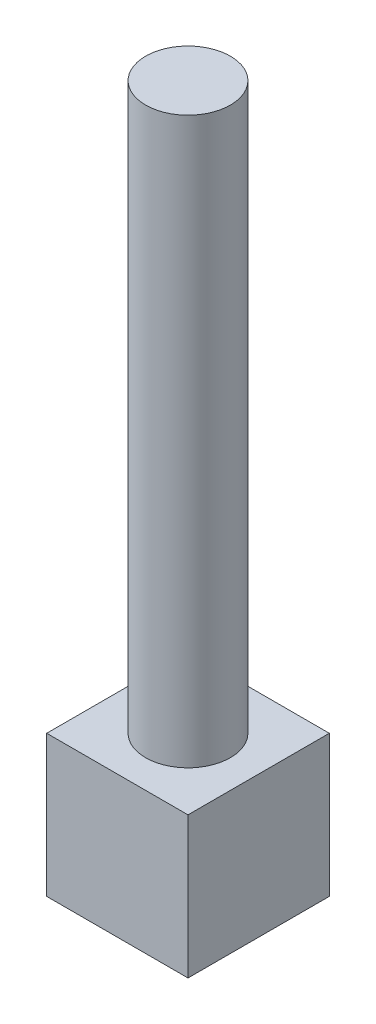
ISO-10303-21;
HEADER;
FILE_DESCRIPTION(('STEP AP214'),'2;1');
FILE_NAME('part.step','',(''),(''),'','','');
FILE_SCHEMA(('AUTOMOTIVE_DESIGN { 1 0 10303 214 1 1 1 1 }'));
ENDSEC;
DATA;
#1=APPLICATION_CONTEXT('core data for automotive mechanical design processes');
#2=APPLICATION_PROTOCOL_DEFINITION('international standard','automotive_design',2000,#1);
#3=PRODUCT_CONTEXT('',#1,'mechanical');
#4=PRODUCT('Part','Part','',(#3));
#5=PRODUCT_RELATED_PRODUCT_CATEGORY('part','',(#4));
#6=PRODUCT_DEFINITION_FORMATION('','',#4);
#7=PRODUCT_DEFINITION_CONTEXT('part definition',#1,'design');
#8=PRODUCT_DEFINITION('design','',#6,#7);
#9=PRODUCT_DEFINITION_SHAPE('','',#8);
#10=(LENGTH_UNIT() NAMED_UNIT(*) SI_UNIT(.MILLI.,.METRE.));
#11=(NAMED_UNIT(*) PLANE_ANGLE_UNIT() SI_UNIT($,.RADIAN.));
#12=(NAMED_UNIT(*) SI_UNIT($,.STERADIAN.) SOLID_ANGLE_UNIT());
#13=UNCERTAINTY_MEASURE_WITH_UNIT(LENGTH_MEASURE(1.E-05),#10,'distance_accuracy_value','');
#14=(GEOMETRIC_REPRESENTATION_CONTEXT(3) GLOBAL_UNCERTAINTY_ASSIGNED_CONTEXT((#13)) GLOBAL_UNIT_ASSIGNED_CONTEXT((#10,
#11,#12)) REPRESENTATION_CONTEXT('',''));
#15=CARTESIAN_POINT('',(0.,0.,0.));
#16=DIRECTION('',(0.,0.,1.));
#17=DIRECTION('',(1.,0.,0.));
#18=AXIS2_PLACEMENT_3D('',#15,#16,#17);
#19=CARTESIAN_POINT('',(-23.9879679144385,10.,-8.73529411764705));
#20=DIRECTION('',(-1.,0.,0.));
#21=DIRECTION('',(0.,0.,1.));
#22=AXIS2_PLACEMENT_3D('',#19,#20,#21);
#23=PLANE('',#22);
#24=DIRECTION('',(0.,0.,-1.));
#25=VECTOR('',#24,1.);
#26=CARTESIAN_POINT('',(-23.9879679144385,0.,-8.73529411764705));
#27=LINE('',#26,#25);
#28=CARTESIAN_POINT('',(-23.9879679144385,0.,1.26470588235294));
#29=VERTEX_POINT('',#28);
#30=CARTESIAN_POINT('',(-23.9879679144385,0.,-8.73529411764705));
#31=VERTEX_POINT('',#30);
#32=EDGE_CURVE('E102',#29,#31,#27,.T.);
#33=ORIENTED_EDGE('',*,*,#32,.T.);
#34=DIRECTION('',(0.,-1.,0.));
#35=VECTOR('',#34,1.);
#36=CARTESIAN_POINT('',(-23.9879679144385,10.,-8.73529411764705));
#37=LINE('',#36,#35);
#38=CARTESIAN_POINT('',(-23.9879679144385,10.,-8.73529411764705));
#39=VERTEX_POINT('',#38);
#40=EDGE_CURVE('E39',#39,#31,#37,.T.);
#41=ORIENTED_EDGE('',*,*,#40,.F.);
#42=DIRECTION('',(0.,0.,-1.));
#43=VECTOR('',#42,1.);
#44=CARTESIAN_POINT('',(-23.9879679144385,10.,-8.73529411764705));
#45=LINE('',#44,#43);
#46=CARTESIAN_POINT('',(-23.9879679144385,10.,1.26470588235294));
#47=VERTEX_POINT('',#46);
#48=EDGE_CURVE('E89',#47,#39,#45,.T.);
#49=ORIENTED_EDGE('',*,*,#48,.F.);
#50=DIRECTION('',(0.,-1.,0.));
#51=VECTOR('',#50,1.);
#52=CARTESIAN_POINT('',(-23.9879679144385,10.,1.26470588235294));
#53=LINE('',#52,#51);
#54=EDGE_CURVE('E98',#47,#29,#53,.T.);
#55=ORIENTED_EDGE('',*,*,#54,.T.);
#56=EDGE_LOOP('',(#33,#41,#49,#55));
#57=FACE_BOUND('',#56,.T.);
#58=ADVANCED_FACE('F36',(#57),#23,.F.);
#59=CARTESIAN_POINT('',(-33.9879679144385,10.,-8.73529411764705));
#60=DIRECTION('',(0.,0.,1.));
#61=DIRECTION('',(1.,0.,0.));
#62=AXIS2_PLACEMENT_3D('',#59,#60,#61);
#63=PLANE('',#62);
#64=DIRECTION('',(-1.,0.,0.));
#65=VECTOR('',#64,1.);
#66=CARTESIAN_POINT('',(-33.9879679144385,0.,-8.73529411764705));
#67=LINE('',#66,#65);
#68=CARTESIAN_POINT('',(-33.9879679144385,0.,-8.73529411764705));
#69=VERTEX_POINT('',#68);
#70=EDGE_CURVE('E94',#31,#69,#67,.T.);
#71=ORIENTED_EDGE('',*,*,#70,.T.);
#72=DIRECTION('',(0.,-1.,0.));
#73=VECTOR('',#72,1.);
#74=CARTESIAN_POINT('',(-33.9879679144385,10.,-8.73529411764705));
#75=LINE('',#74,#73);
#76=CARTESIAN_POINT('',(-33.9879679144385,10.,-8.73529411764705));
#77=VERTEX_POINT('',#76);
#78=EDGE_CURVE('E92',#77,#69,#75,.T.);
#79=ORIENTED_EDGE('',*,*,#78,.F.);
#80=DIRECTION('',(-1.,0.,0.));
#81=VECTOR('',#80,1.);
#82=CARTESIAN_POINT('',(-33.9879679144385,10.,-8.73529411764705));
#83=LINE('',#82,#81);
#84=EDGE_CURVE('E84',#39,#77,#83,.T.);
#85=ORIENTED_EDGE('',*,*,#84,.F.);
#86=ORIENTED_EDGE('',*,*,#40,.T.);
#87=EDGE_LOOP('',(#71,#79,#85,#86));
#88=FACE_BOUND('',#87,.T.);
#89=ADVANCED_FACE('F93',(#88),#63,.F.);
#90=CARTESIAN_POINT('',(-33.9879679144385,10.,-8.73529411764705));
#91=DIRECTION('',(1.,0.,0.));
#92=DIRECTION('',(0.,0.,-1.));
#93=AXIS2_PLACEMENT_3D('',#90,#91,#92);
#94=PLANE('',#93);
#95=DIRECTION('',(0.,0.,1.));
#96=VECTOR('',#95,1.);
#97=CARTESIAN_POINT('',(-33.9879679144385,0.,-8.73529411764705));
#98=LINE('',#97,#96);
#99=CARTESIAN_POINT('',(-33.9879679144385,0.,1.26470588235294));
#100=VERTEX_POINT('',#99);
#101=EDGE_CURVE('E70',#69,#100,#98,.T.);
#102=ORIENTED_EDGE('',*,*,#101,.T.);
#103=DIRECTION('',(0.,-1.,0.));
#104=VECTOR('',#103,1.);
#105=CARTESIAN_POINT('',(-33.9879679144385,10.,1.26470588235294));
#106=LINE('',#105,#104);
#107=CARTESIAN_POINT('',(-33.9879679144385,10.,1.26470588235294));
#108=VERTEX_POINT('',#107);
#109=EDGE_CURVE('E95',#108,#100,#106,.T.);
#110=ORIENTED_EDGE('',*,*,#109,.F.);
#111=DIRECTION('',(0.,0.,1.));
#112=VECTOR('',#111,1.);
#113=CARTESIAN_POINT('',(-33.9879679144385,10.,-8.73529411764705));
#114=LINE('',#113,#112);
#115=EDGE_CURVE('E87',#77,#108,#114,.T.);
#116=ORIENTED_EDGE('',*,*,#115,.F.);
#117=ORIENTED_EDGE('',*,*,#78,.T.);
#118=EDGE_LOOP('',(#102,#110,#116,#117));
#119=FACE_BOUND('',#118,.T.);
#120=ADVANCED_FACE('F96',(#119),#94,.F.);
#121=CARTESIAN_POINT('',(-33.9879679144385,10.,1.26470588235294));
#122=DIRECTION('',(0.,0.,-1.));
#123=DIRECTION('',(-1.,0.,0.));
#124=AXIS2_PLACEMENT_3D('',#121,#122,#123);
#125=PLANE('',#124);
#126=DIRECTION('',(1.,0.,0.));
#127=VECTOR('',#126,1.);
#128=CARTESIAN_POINT('',(-33.9879679144385,0.,1.26470588235294));
#129=LINE('',#128,#127);
#130=EDGE_CURVE('E76',#100,#29,#129,.T.);
#131=ORIENTED_EDGE('',*,*,#130,.T.);
#132=ORIENTED_EDGE('',*,*,#54,.F.);
#133=DIRECTION('',(1.,0.,0.));
#134=VECTOR('',#133,1.);
#135=CARTESIAN_POINT('',(-33.9879679144385,10.,1.26470588235294));
#136=LINE('',#135,#134);
#137=EDGE_CURVE('E53',#108,#47,#136,.T.);
#138=ORIENTED_EDGE('',*,*,#137,.F.);
#139=ORIENTED_EDGE('',*,*,#109,.T.);
#140=EDGE_LOOP('',(#131,#132,#138,#139));
#141=FACE_BOUND('',#140,.T.);
#142=ADVANCED_FACE('F110',(#141),#125,.F.);
#143=CARTESIAN_POINT('',(0.,10.,0.));
#144=DIRECTION('',(0.,1.,0.));
#145=DIRECTION('',(0.,0.,1.));
#146=AXIS2_PLACEMENT_3D('',#143,#144,#145);
#147=PLANE('',#146);
#148=CARTESIAN_POINT('',(-28.9879679144385,10.,-3.73529411764705));
#149=DIRECTION('',(0.,1.,0.));
#150=DIRECTION('',(0.,0.,1.));
#151=AXIS2_PLACEMENT_3D('',#148,#149,#150);
#152=CIRCLE('',#151,3.);
#153=CARTESIAN_POINT('',(-28.9879679144385,10.,-0.73529411764705));
#154=VERTEX_POINT('',#153);
#155=EDGE_CURVE('E11',#154,#154,#152,.T.);
#156=ORIENTED_EDGE('',*,*,#155,.F.);
#157=EDGE_LOOP('',(#156));
#158=FACE_BOUND('',#157,.T.);
#159=ORIENTED_EDGE('',*,*,#48,.T.);
#160=ORIENTED_EDGE('',*,*,#84,.T.);
#161=ORIENTED_EDGE('',*,*,#115,.T.);
#162=ORIENTED_EDGE('',*,*,#137,.T.);
#163=EDGE_LOOP('',(#159,#160,#161,#162));
#164=FACE_BOUND('',#163,.T.);
#165=ADVANCED_FACE('F85',(#158,#164),#147,.T.);
#166=CARTESIAN_POINT('',(0.,0.,0.));
#167=DIRECTION('',(0.,1.,0.));
#168=DIRECTION('',(0.,0.,1.));
#169=AXIS2_PLACEMENT_3D('',#166,#167,#168);
#170=PLANE('',#169);
#171=ORIENTED_EDGE('',*,*,#32,.F.);
#172=ORIENTED_EDGE('',*,*,#130,.F.);
#173=ORIENTED_EDGE('',*,*,#101,.F.);
#174=ORIENTED_EDGE('',*,*,#70,.F.);
#175=EDGE_LOOP('',(#171,#172,#173,#174));
#176=FACE_BOUND('',#175,.T.);
#177=ADVANCED_FACE('F113',(#176),#170,.F.);
#178=CARTESIAN_POINT('',(-28.9879679144385,50.,-3.73529411764705));
#179=DIRECTION('',(0.,-1.,0.));
#180=DIRECTION('',(0.,0.,-1.));
#181=AXIS2_PLACEMENT_3D('',#178,#179,#180);
#182=CYLINDRICAL_SURFACE('',#181,3.);
#183=CARTESIAN_POINT('',(-28.9879679144385,50.,-3.73529411764705));
#184=DIRECTION('',(0.,1.,0.));
#185=DIRECTION('',(0.,0.,1.));
#186=AXIS2_PLACEMENT_3D('',#183,#184,#185);
#187=CIRCLE('',#186,3.);
#188=CARTESIAN_POINT('',(-28.9879679144385,50.,-0.73529411764705));
#189=VERTEX_POINT('',#188);
#190=EDGE_CURVE('E105',#189,#189,#187,.T.);
#191=ORIENTED_EDGE('',*,*,#190,.F.);
#192=EDGE_LOOP('',(#191));
#193=FACE_BOUND('',#192,.T.);
#194=ORIENTED_EDGE('',*,*,#155,.T.);
#195=EDGE_LOOP('',(#194));
#196=FACE_BOUND('',#195,.T.);
#197=ADVANCED_FACE('F121',(#193,#196),#182,.T.);
#198=CARTESIAN_POINT('',(-28.9879679144385,50.,-3.73529411764705));
#199=DIRECTION('',(0.,1.,0.));
#200=DIRECTION('',(0.,0.,1.));
#201=AXIS2_PLACEMENT_3D('',#198,#199,#200);
#202=PLANE('',#201);
#203=ORIENTED_EDGE('',*,*,#190,.T.);
#204=EDGE_LOOP('',(#203));
#205=FACE_BOUND('',#204,.T.);
#206=ADVANCED_FACE('F119',(#205),#202,.T.);
#207=CLOSED_SHELL('',(#58,#89,#120,#142,#165,#177,#197,#206));
#208=MANIFOLD_SOLID_BREP('B2',#207);
#209=ADVANCED_BREP_SHAPE_REPRESENTATION('',(#18,#208),#14);
#210=SHAPE_DEFINITION_REPRESENTATION(#9,#209);
ENDSEC;
END-ISO-10303-21;
